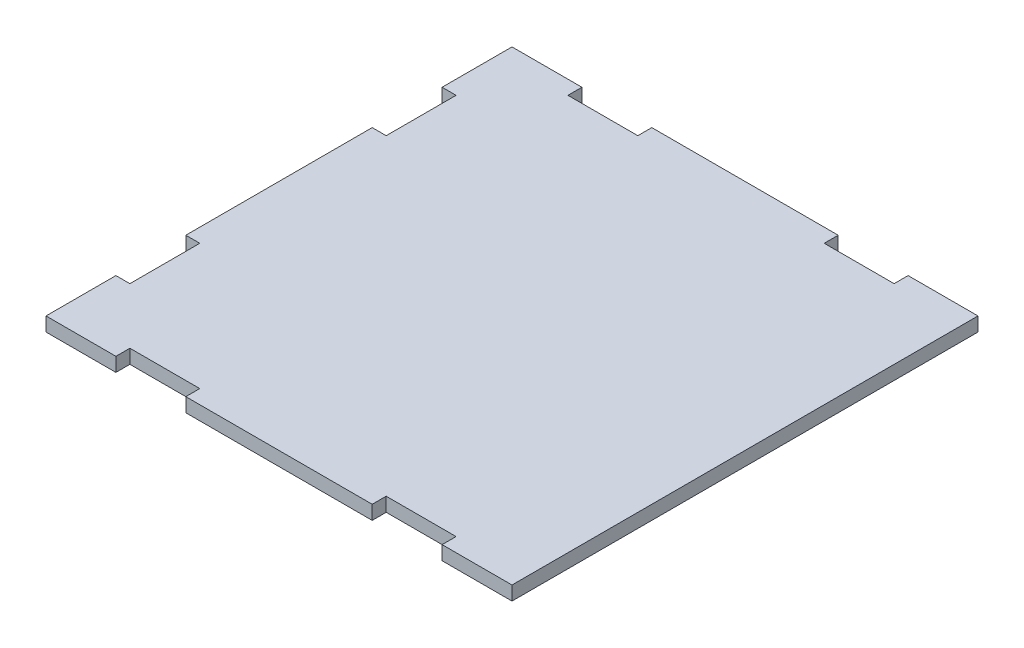
ISO-10303-21;
HEADER;
FILE_DESCRIPTION(('STEP AP214'),'2;1');
FILE_NAME('part.step','',(''),(''),'','','');
FILE_SCHEMA(('AUTOMOTIVE_DESIGN { 1 0 10303 214 1 1 1 1 }'));
ENDSEC;
DATA;
#1=APPLICATION_CONTEXT('core data for automotive mechanical design processes');
#2=APPLICATION_PROTOCOL_DEFINITION('international standard','automotive_design',2000,#1);
#3=PRODUCT_CONTEXT('',#1,'mechanical');
#4=PRODUCT('Part','Part','',(#3));
#5=PRODUCT_RELATED_PRODUCT_CATEGORY('part','',(#4));
#6=PRODUCT_DEFINITION_FORMATION('','',#4);
#7=PRODUCT_DEFINITION_CONTEXT('part definition',#1,'design');
#8=PRODUCT_DEFINITION('design','',#6,#7);
#9=PRODUCT_DEFINITION_SHAPE('','',#8);
#10=(LENGTH_UNIT() NAMED_UNIT(*) SI_UNIT(.MILLI.,.METRE.));
#11=(NAMED_UNIT(*) PLANE_ANGLE_UNIT() SI_UNIT($,.RADIAN.));
#12=(NAMED_UNIT(*) SI_UNIT($,.STERADIAN.) SOLID_ANGLE_UNIT());
#13=UNCERTAINTY_MEASURE_WITH_UNIT(LENGTH_MEASURE(1.E-05),#10,'distance_accuracy_value','');
#14=(GEOMETRIC_REPRESENTATION_CONTEXT(3) GLOBAL_UNCERTAINTY_ASSIGNED_CONTEXT((#13)) GLOBAL_UNIT_ASSIGNED_CONTEXT((#10,
#11,#12)) REPRESENTATION_CONTEXT('',''));
#15=CARTESIAN_POINT('',(0.,0.,0.));
#16=DIRECTION('',(0.,0.,1.));
#17=DIRECTION('',(1.,0.,0.));
#18=AXIS2_PLACEMENT_3D('',#15,#16,#17);
#19=CARTESIAN_POINT('',(-100.,6.,-100.));
#20=DIRECTION('',(0.,0.,1.));
#21=DIRECTION('',(1.,0.,0.));
#22=AXIS2_PLACEMENT_3D('',#19,#20,#21);
#23=PLANE('',#22);
#24=DIRECTION('',(-1.,0.,0.));
#25=VECTOR('',#24,1.);
#26=CARTESIAN_POINT('',(-100.,6.,-100.));
#27=LINE('',#26,#25);
#28=CARTESIAN_POINT('',(40.,6.,-100.));
#29=VERTEX_POINT('',#28);
#30=CARTESIAN_POINT('',(-40.,6.,-100.));
#31=VERTEX_POINT('',#30);
#32=EDGE_CURVE('E479',#29,#31,#27,.T.);
#33=ORIENTED_EDGE('',*,*,#32,.F.);
#34=DIRECTION('',(0.,1.,0.));
#35=VECTOR('',#34,1.);
#36=CARTESIAN_POINT('',(40.,-4.,-100.));
#37=LINE('',#36,#35);
#38=CARTESIAN_POINT('',(40.,0.,-100.));
#39=VERTEX_POINT('',#38);
#40=EDGE_CURVE('E401',#39,#29,#37,.T.);
#41=ORIENTED_EDGE('',*,*,#40,.F.);
#42=DIRECTION('',(-1.,0.,0.));
#43=VECTOR('',#42,1.);
#44=CARTESIAN_POINT('',(-100.,0.,-100.));
#45=LINE('',#44,#43);
#46=CARTESIAN_POINT('',(-40.,0.,-100.));
#47=VERTEX_POINT('',#46);
#48=EDGE_CURVE('E287',#39,#47,#45,.T.);
#49=ORIENTED_EDGE('',*,*,#48,.T.);
#50=DIRECTION('',(0.,1.,0.));
#51=VECTOR('',#50,1.);
#52=CARTESIAN_POINT('',(-40.,-4.,-100.));
#53=LINE('',#52,#51);
#54=EDGE_CURVE('E435',#47,#31,#53,.T.);
#55=ORIENTED_EDGE('',*,*,#54,.T.);
#56=EDGE_LOOP('',(#33,#41,#49,#55));
#57=FACE_BOUND('',#56,.T.);
#58=ADVANCED_FACE('F45',(#57),#23,.F.);
#59=CARTESIAN_POINT('',(-70.,6.,-100.));
#60=VERTEX_POINT('',#59);
#61=CARTESIAN_POINT('',(-100.,6.,-100.));
#62=VERTEX_POINT('',#61);
#63=EDGE_CURVE('E474',#60,#62,#27,.T.);
#64=ORIENTED_EDGE('',*,*,#63,.F.);
#65=DIRECTION('',(0.,1.,0.));
#66=VECTOR('',#65,1.);
#67=CARTESIAN_POINT('',(-70.,-4.,-100.));
#68=LINE('',#67,#66);
#69=CARTESIAN_POINT('',(-70.,0.,-100.));
#70=VERTEX_POINT('',#69);
#71=EDGE_CURVE('E439',#70,#60,#68,.T.);
#72=ORIENTED_EDGE('',*,*,#71,.F.);
#73=CARTESIAN_POINT('',(-100.,0.,-100.));
#74=VERTEX_POINT('',#73);
#75=EDGE_CURVE('E280',#70,#74,#45,.T.);
#76=ORIENTED_EDGE('',*,*,#75,.T.);
#77=DIRECTION('',(0.,-1.,0.));
#78=VECTOR('',#77,1.);
#79=CARTESIAN_POINT('',(-100.,6.,-100.));
#80=LINE('',#79,#78);
#81=EDGE_CURVE('E306',#62,#74,#80,.T.);
#82=ORIENTED_EDGE('',*,*,#81,.F.);
#83=EDGE_LOOP('',(#64,#72,#76,#82));
#84=FACE_BOUND('',#83,.T.);
#85=ADVANCED_FACE('F534',(#84),#23,.F.);
#86=CARTESIAN_POINT('',(-100.,6.,100.));
#87=DIRECTION('',(1.,0.,0.));
#88=DIRECTION('',(0.,0.,-1.));
#89=AXIS2_PLACEMENT_3D('',#86,#87,#88);
#90=PLANE('',#89);
#91=DIRECTION('',(0.,0.,1.));
#92=VECTOR('',#91,1.);
#93=CARTESIAN_POINT('',(-100.,0.,100.));
#94=LINE('',#93,#92);
#95=CARTESIAN_POINT('',(-100.,0.,-70.));
#96=VERTEX_POINT('',#95);
#97=EDGE_CURVE('E288',#74,#96,#94,.T.);
#98=ORIENTED_EDGE('',*,*,#97,.T.);
#99=DIRECTION('',(0.,1.,0.));
#100=VECTOR('',#99,1.);
#101=CARTESIAN_POINT('',(-100.,-4.,-70.));
#102=LINE('',#101,#100);
#103=CARTESIAN_POINT('',(-100.,6.,-70.));
#104=VERTEX_POINT('',#103);
#105=EDGE_CURVE('E392',#96,#104,#102,.T.);
#106=ORIENTED_EDGE('',*,*,#105,.T.);
#107=DIRECTION('',(0.,0.,1.));
#108=VECTOR('',#107,1.);
#109=CARTESIAN_POINT('',(-100.,6.,100.));
#110=LINE('',#109,#108);
#111=EDGE_CURVE('E260',#62,#104,#110,.T.);
#112=ORIENTED_EDGE('',*,*,#111,.F.);
#113=ORIENTED_EDGE('',*,*,#81,.T.);
#114=EDGE_LOOP('',(#98,#106,#112,#113));
#115=FACE_BOUND('',#114,.T.);
#116=ADVANCED_FACE('F538',(#115),#90,.F.);
#117=CARTESIAN_POINT('',(-100.,6.,-40.));
#118=VERTEX_POINT('',#117);
#119=CARTESIAN_POINT('',(-100.,6.,40.));
#120=VERTEX_POINT('',#119);
#121=EDGE_CURVE('E249',#118,#120,#110,.T.);
#122=ORIENTED_EDGE('',*,*,#121,.F.);
#123=DIRECTION('',(0.,1.,0.));
#124=VECTOR('',#123,1.);
#125=CARTESIAN_POINT('',(-100.,-4.,-40.));
#126=LINE('',#125,#124);
#127=CARTESIAN_POINT('',(-100.,0.,-40.));
#128=VERTEX_POINT('',#127);
#129=EDGE_CURVE('E377',#128,#118,#126,.T.);
#130=ORIENTED_EDGE('',*,*,#129,.F.);
#131=CARTESIAN_POINT('',(-100.,0.,40.));
#132=VERTEX_POINT('',#131);
#133=EDGE_CURVE('E251',#128,#132,#94,.T.);
#134=ORIENTED_EDGE('',*,*,#133,.T.);
#135=DIRECTION('',(0.,1.,0.));
#136=VECTOR('',#135,1.);
#137=CARTESIAN_POINT('',(-100.,-4.,40.));
#138=LINE('',#137,#136);
#139=EDGE_CURVE('E232',#132,#120,#138,.T.);
#140=ORIENTED_EDGE('',*,*,#139,.T.);
#141=EDGE_LOOP('',(#122,#130,#134,#140));
#142=FACE_BOUND('',#141,.T.);
#143=ADVANCED_FACE('F247',(#142),#90,.F.);
#144=CARTESIAN_POINT('',(-100.,6.,100.));
#145=DIRECTION('',(0.,0.,-1.));
#146=DIRECTION('',(-1.,0.,0.));
#147=AXIS2_PLACEMENT_3D('',#144,#145,#146);
#148=PLANE('',#147);
#149=DIRECTION('',(1.,0.,0.));
#150=VECTOR('',#149,1.);
#151=CARTESIAN_POINT('',(-100.,0.,100.));
#152=LINE('',#151,#150);
#153=CARTESIAN_POINT('',(-40.,0.,100.));
#154=VERTEX_POINT('',#153);
#155=CARTESIAN_POINT('',(40.,0.,100.));
#156=VERTEX_POINT('',#155);
#157=EDGE_CURVE('E298',#154,#156,#152,.T.);
#158=ORIENTED_EDGE('',*,*,#157,.T.);
#159=DIRECTION('',(0.,1.,0.));
#160=VECTOR('',#159,1.);
#161=CARTESIAN_POINT('',(40.,-4.,100.));
#162=LINE('',#161,#160);
#163=CARTESIAN_POINT('',(40.,6.,100.));
#164=VERTEX_POINT('',#163);
#165=EDGE_CURVE('E402',#156,#164,#162,.T.);
#166=ORIENTED_EDGE('',*,*,#165,.T.);
#167=DIRECTION('',(1.,0.,0.));
#168=VECTOR('',#167,1.);
#169=CARTESIAN_POINT('',(-100.,6.,100.));
#170=LINE('',#169,#168);
#171=CARTESIAN_POINT('',(-40.,6.,100.));
#172=VERTEX_POINT('',#171);
#173=EDGE_CURVE('E275',#172,#164,#170,.T.);
#174=ORIENTED_EDGE('',*,*,#173,.F.);
#175=DIRECTION('',(0.,1.,0.));
#176=VECTOR('',#175,1.);
#177=CARTESIAN_POINT('',(-40.,-4.,100.));
#178=LINE('',#177,#176);
#179=EDGE_CURVE('E467',#154,#172,#178,.T.);
#180=ORIENTED_EDGE('',*,*,#179,.F.);
#181=EDGE_LOOP('',(#158,#166,#174,#180));
#182=FACE_BOUND('',#181,.T.);
#183=ADVANCED_FACE('F552',(#182),#148,.F.);
#184=CARTESIAN_POINT('',(-100.,0.,100.));
#185=VERTEX_POINT('',#184);
#186=CARTESIAN_POINT('',(-70.,0.,100.));
#187=VERTEX_POINT('',#186);
#188=EDGE_CURVE('E293',#185,#187,#152,.T.);
#189=ORIENTED_EDGE('',*,*,#188,.T.);
#190=DIRECTION('',(0.,1.,0.));
#191=VECTOR('',#190,1.);
#192=CARTESIAN_POINT('',(-70.,-4.,100.));
#193=LINE('',#192,#191);
#194=CARTESIAN_POINT('',(-70.,6.,100.));
#195=VERTEX_POINT('',#194);
#196=EDGE_CURVE('E461',#187,#195,#193,.T.);
#197=ORIENTED_EDGE('',*,*,#196,.T.);
#198=CARTESIAN_POINT('',(-100.,6.,100.));
#199=VERTEX_POINT('',#198);
#200=EDGE_CURVE('E270',#199,#195,#170,.T.);
#201=ORIENTED_EDGE('',*,*,#200,.F.);
#202=DIRECTION('',(0.,-1.,0.));
#203=VECTOR('',#202,1.);
#204=CARTESIAN_POINT('',(-100.,6.,100.));
#205=LINE('',#204,#203);
#206=EDGE_CURVE('E302',#199,#185,#205,.T.);
#207=ORIENTED_EDGE('',*,*,#206,.T.);
#208=EDGE_LOOP('',(#189,#197,#201,#207));
#209=FACE_BOUND('',#208,.T.);
#210=ADVANCED_FACE('F605',(#209),#148,.F.);
#211=CARTESIAN_POINT('',(100.,6.,100.));
#212=DIRECTION('',(-1.,0.,0.));
#213=DIRECTION('',(0.,0.,1.));
#214=AXIS2_PLACEMENT_3D('',#211,#212,#213);
#215=PLANE('',#214);
#216=DIRECTION('',(0.,0.,-1.));
#217=VECTOR('',#216,1.);
#218=CARTESIAN_POINT('',(100.,0.,100.));
#219=LINE('',#218,#217);
#220=CARTESIAN_POINT('',(100.,0.,100.));
#221=VERTEX_POINT('',#220);
#222=CARTESIAN_POINT('',(100.,0.,-100.));
#223=VERTEX_POINT('',#222);
#224=EDGE_CURVE('E276',#221,#223,#219,.T.);
#225=ORIENTED_EDGE('',*,*,#224,.T.);
#226=DIRECTION('',(0.,-1.,0.));
#227=VECTOR('',#226,1.);
#228=CARTESIAN_POINT('',(100.,6.,-100.));
#229=LINE('',#228,#227);
#230=CARTESIAN_POINT('',(100.,6.,-100.));
#231=VERTEX_POINT('',#230);
#232=EDGE_CURVE('E310',#231,#223,#229,.T.);
#233=ORIENTED_EDGE('',*,*,#232,.F.);
#234=DIRECTION('',(0.,0.,-1.));
#235=VECTOR('',#234,1.);
#236=CARTESIAN_POINT('',(100.,6.,100.));
#237=LINE('',#236,#235);
#238=CARTESIAN_POINT('',(100.,6.,100.));
#239=VERTEX_POINT('',#238);
#240=EDGE_CURVE('E297',#239,#231,#237,.T.);
#241=ORIENTED_EDGE('',*,*,#240,.F.);
#242=DIRECTION('',(0.,-1.,0.));
#243=VECTOR('',#242,1.);
#244=CARTESIAN_POINT('',(100.,6.,100.));
#245=LINE('',#244,#243);
#246=EDGE_CURVE('E274',#239,#221,#245,.T.);
#247=ORIENTED_EDGE('',*,*,#246,.T.);
#248=EDGE_LOOP('',(#225,#233,#241,#247));
#249=FACE_BOUND('',#248,.T.);
#250=ADVANCED_FACE('F47',(#249),#215,.F.);
#251=CARTESIAN_POINT('',(70.,0.,-100.));
#252=VERTEX_POINT('',#251);
#253=EDGE_CURVE('E282',#223,#252,#45,.T.);
#254=ORIENTED_EDGE('',*,*,#253,.T.);
#255=DIRECTION('',(0.,1.,0.));
#256=VECTOR('',#255,1.);
#257=CARTESIAN_POINT('',(70.,-4.,-100.));
#258=LINE('',#257,#256);
#259=CARTESIAN_POINT('',(70.,6.,-100.));
#260=VERTEX_POINT('',#259);
#261=EDGE_CURVE('E492',#252,#260,#258,.T.);
#262=ORIENTED_EDGE('',*,*,#261,.T.);
#263=EDGE_CURVE('E266',#231,#260,#27,.T.);
#264=ORIENTED_EDGE('',*,*,#263,.F.);
#265=ORIENTED_EDGE('',*,*,#232,.T.);
#266=EDGE_LOOP('',(#254,#262,#264,#265));
#267=FACE_BOUND('',#266,.T.);
#268=ADVANCED_FACE('F491',(#267),#23,.F.);
#269=CARTESIAN_POINT('',(-100.,6.,70.));
#270=VERTEX_POINT('',#269);
#271=EDGE_CURVE('E261',#270,#199,#110,.T.);
#272=ORIENTED_EDGE('',*,*,#271,.F.);
#273=DIRECTION('',(0.,1.,0.));
#274=VECTOR('',#273,1.);
#275=CARTESIAN_POINT('',(-100.,-4.,70.));
#276=LINE('',#275,#274);
#277=CARTESIAN_POINT('',(-100.,0.,70.));
#278=VERTEX_POINT('',#277);
#279=EDGE_CURVE('E242',#278,#270,#276,.T.);
#280=ORIENTED_EDGE('',*,*,#279,.F.);
#281=EDGE_CURVE('E286',#278,#185,#94,.T.);
#282=ORIENTED_EDGE('',*,*,#281,.T.);
#283=ORIENTED_EDGE('',*,*,#206,.F.);
#284=EDGE_LOOP('',(#272,#280,#282,#283));
#285=FACE_BOUND('',#284,.T.);
#286=ADVANCED_FACE('F599',(#285),#90,.F.);
#287=CARTESIAN_POINT('',(70.,6.,100.));
#288=VERTEX_POINT('',#287);
#289=EDGE_CURVE('E265',#288,#239,#170,.T.);
#290=ORIENTED_EDGE('',*,*,#289,.F.);
#291=DIRECTION('',(0.,1.,0.));
#292=VECTOR('',#291,1.);
#293=CARTESIAN_POINT('',(70.,-4.,100.));
#294=LINE('',#293,#292);
#295=CARTESIAN_POINT('',(70.,0.,100.));
#296=VERTEX_POINT('',#295);
#297=EDGE_CURVE('E407',#296,#288,#294,.T.);
#298=ORIENTED_EDGE('',*,*,#297,.F.);
#299=EDGE_CURVE('E292',#296,#221,#152,.T.);
#300=ORIENTED_EDGE('',*,*,#299,.T.);
#301=ORIENTED_EDGE('',*,*,#246,.F.);
#302=EDGE_LOOP('',(#290,#298,#300,#301));
#303=FACE_BOUND('',#302,.T.);
#304=ADVANCED_FACE('F576',(#303),#148,.F.);
#305=CARTESIAN_POINT('',(0.,6.,0.));
#306=DIRECTION('',(0.,-1.,0.));
#307=DIRECTION('',(0.,0.,-1.));
#308=AXIS2_PLACEMENT_3D('',#305,#306,#307);
#309=PLANE('',#308);
#310=ORIENTED_EDGE('',*,*,#111,.T.);
#311=DIRECTION('',(-1.,0.,0.));
#312=VECTOR('',#311,1.);
#313=CARTESIAN_POINT('',(-100.,6.,-70.));
#314=LINE('',#313,#312);
#315=CARTESIAN_POINT('',(-94.,6.,-70.));
#316=VERTEX_POINT('',#315);
#317=EDGE_CURVE('E379',#316,#104,#314,.T.);
#318=ORIENTED_EDGE('',*,*,#317,.F.);
#319=DIRECTION('',(0.,0.,-1.));
#320=VECTOR('',#319,1.);
#321=CARTESIAN_POINT('',(-94.,6.,-70.));
#322=LINE('',#321,#320);
#323=CARTESIAN_POINT('',(-94.,6.,-40.));
#324=VERTEX_POINT('',#323);
#325=EDGE_CURVE('E383',#324,#316,#322,.T.);
#326=ORIENTED_EDGE('',*,*,#325,.F.);
#327=DIRECTION('',(1.,0.,0.));
#328=VECTOR('',#327,1.);
#329=CARTESIAN_POINT('',(-100.,6.,-40.));
#330=LINE('',#329,#328);
#331=EDGE_CURVE('E258',#118,#324,#330,.T.);
#332=ORIENTED_EDGE('',*,*,#331,.F.);
#333=ORIENTED_EDGE('',*,*,#121,.T.);
#334=DIRECTION('',(-1.,0.,0.));
#335=VECTOR('',#334,1.);
#336=CARTESIAN_POINT('',(-100.,6.,40.));
#337=LINE('',#336,#335);
#338=CARTESIAN_POINT('',(-94.,6.,40.));
#339=VERTEX_POINT('',#338);
#340=EDGE_CURVE('E229',#339,#120,#337,.T.);
#341=ORIENTED_EDGE('',*,*,#340,.F.);
#342=DIRECTION('',(0.,0.,-1.));
#343=VECTOR('',#342,1.);
#344=CARTESIAN_POINT('',(-94.,6.,40.));
#345=LINE('',#344,#343);
#346=CARTESIAN_POINT('',(-94.,6.,70.));
#347=VERTEX_POINT('',#346);
#348=EDGE_CURVE('E241',#347,#339,#345,.T.);
#349=ORIENTED_EDGE('',*,*,#348,.F.);
#350=DIRECTION('',(1.,0.,0.));
#351=VECTOR('',#350,1.);
#352=CARTESIAN_POINT('',(-100.,6.,70.));
#353=LINE('',#352,#351);
#354=EDGE_CURVE('E395',#270,#347,#353,.T.);
#355=ORIENTED_EDGE('',*,*,#354,.F.);
#356=ORIENTED_EDGE('',*,*,#271,.T.);
#357=ORIENTED_EDGE('',*,*,#200,.T.);
#358=DIRECTION('',(0.,0.,1.));
#359=VECTOR('',#358,1.);
#360=CARTESIAN_POINT('',(-70.,6.,100.));
#361=LINE('',#360,#359);
#362=CARTESIAN_POINT('',(-70.,6.,94.));
#363=VERTEX_POINT('',#362);
#364=EDGE_CURVE('E427',#363,#195,#361,.T.);
#365=ORIENTED_EDGE('',*,*,#364,.F.);
#366=DIRECTION('',(-1.,0.,0.));
#367=VECTOR('',#366,1.);
#368=CARTESIAN_POINT('',(-70.,6.,94.));
#369=LINE('',#368,#367);
#370=CARTESIAN_POINT('',(-40.,6.,94.));
#371=VERTEX_POINT('',#370);
#372=EDGE_CURVE('E457',#371,#363,#369,.T.);
#373=ORIENTED_EDGE('',*,*,#372,.F.);
#374=DIRECTION('',(0.,0.,-1.));
#375=VECTOR('',#374,1.);
#376=CARTESIAN_POINT('',(-40.,6.,100.));
#377=LINE('',#376,#375);
#378=EDGE_CURVE('E453',#172,#371,#377,.T.);
#379=ORIENTED_EDGE('',*,*,#378,.F.);
#380=ORIENTED_EDGE('',*,*,#173,.T.);
#381=DIRECTION('',(0.,0.,1.));
#382=VECTOR('',#381,1.);
#383=CARTESIAN_POINT('',(40.,6.,100.));
#384=LINE('',#383,#382);
#385=CARTESIAN_POINT('',(40.,6.,94.));
#386=VERTEX_POINT('',#385);
#387=EDGE_CURVE('E424',#386,#164,#384,.T.);
#388=ORIENTED_EDGE('',*,*,#387,.F.);
#389=DIRECTION('',(-1.,0.,0.));
#390=VECTOR('',#389,1.);
#391=CARTESIAN_POINT('',(40.,6.,94.));
#392=LINE('',#391,#390);
#393=CARTESIAN_POINT('',(70.,6.,94.));
#394=VERTEX_POINT('',#393);
#395=EDGE_CURVE('E406',#394,#386,#392,.T.);
#396=ORIENTED_EDGE('',*,*,#395,.F.);
#397=DIRECTION('',(0.,0.,-1.));
#398=VECTOR('',#397,1.);
#399=CARTESIAN_POINT('',(70.,6.,100.));
#400=LINE('',#399,#398);
#401=EDGE_CURVE('E420',#288,#394,#400,.T.);
#402=ORIENTED_EDGE('',*,*,#401,.F.);
#403=ORIENTED_EDGE('',*,*,#289,.T.);
#404=ORIENTED_EDGE('',*,*,#240,.T.);
#405=ORIENTED_EDGE('',*,*,#263,.T.);
#406=DIRECTION('',(0.,0.,-1.));
#407=VECTOR('',#406,1.);
#408=CARTESIAN_POINT('',(70.,6.,-100.));
#409=LINE('',#408,#407);
#410=CARTESIAN_POINT('',(70.,6.,-94.));
#411=VERTEX_POINT('',#410);
#412=EDGE_CURVE('E488',#411,#260,#409,.T.);
#413=ORIENTED_EDGE('',*,*,#412,.F.);
#414=DIRECTION('',(1.,0.,0.));
#415=VECTOR('',#414,1.);
#416=CARTESIAN_POINT('',(40.,6.,-94.));
#417=LINE('',#416,#415);
#418=CARTESIAN_POINT('',(40.,6.,-94.));
#419=VERTEX_POINT('',#418);
#420=EDGE_CURVE('E505',#419,#411,#417,.T.);
#421=ORIENTED_EDGE('',*,*,#420,.F.);
#422=DIRECTION('',(0.,0.,1.));
#423=VECTOR('',#422,1.);
#424=CARTESIAN_POINT('',(40.,6.,-100.));
#425=LINE('',#424,#423);
#426=EDGE_CURVE('E387',#29,#419,#425,.T.);
#427=ORIENTED_EDGE('',*,*,#426,.F.);
#428=ORIENTED_EDGE('',*,*,#32,.T.);
#429=DIRECTION('',(0.,0.,-1.));
#430=VECTOR('',#429,1.);
#431=CARTESIAN_POINT('',(-40.,6.,-100.));
#432=LINE('',#431,#430);
#433=CARTESIAN_POINT('',(-40.,6.,-94.));
#434=VERTEX_POINT('',#433);
#435=EDGE_CURVE('E431',#434,#31,#432,.T.);
#436=ORIENTED_EDGE('',*,*,#435,.F.);
#437=DIRECTION('',(1.,0.,0.));
#438=VECTOR('',#437,1.);
#439=CARTESIAN_POINT('',(-70.,6.,-94.));
#440=LINE('',#439,#438);
#441=CARTESIAN_POINT('',(-70.,6.,-94.));
#442=VERTEX_POINT('',#441);
#443=EDGE_CURVE('E444',#442,#434,#440,.T.);
#444=ORIENTED_EDGE('',*,*,#443,.F.);
#445=DIRECTION('',(0.,0.,1.));
#446=VECTOR('',#445,1.);
#447=CARTESIAN_POINT('',(-70.,6.,-100.));
#448=LINE('',#447,#446);
#449=EDGE_CURVE('E416',#60,#442,#448,.T.);
#450=ORIENTED_EDGE('',*,*,#449,.F.);
#451=ORIENTED_EDGE('',*,*,#63,.T.);
#452=EDGE_LOOP('',(#310,#318,#326,#332,#333,#341,#349,#355,#356,#357,#365,#373,#379,#380,#388,
#396,#402,#403,#404,#405,#413,#421,#427,#428,#436,#444,#450,#451));
#453=FACE_BOUND('',#452,.T.);
#454=ADVANCED_FACE('F256',(#453),#309,.F.);
#455=CARTESIAN_POINT('',(0.,0.,0.));
#456=DIRECTION('',(0.,-1.,0.));
#457=DIRECTION('',(0.,0.,-1.));
#458=AXIS2_PLACEMENT_3D('',#455,#456,#457);
#459=PLANE('',#458);
#460=DIRECTION('',(1.,0.,0.));
#461=VECTOR('',#460,1.);
#462=CARTESIAN_POINT('',(0.,0.,-70.));
#463=LINE('',#462,#461);
#464=CARTESIAN_POINT('',(-94.,0.,-70.));
#465=VERTEX_POINT('',#464);
#466=EDGE_CURVE('E11',#96,#465,#463,.T.);
#467=ORIENTED_EDGE('',*,*,#466,.F.);
#468=ORIENTED_EDGE('',*,*,#97,.F.);
#469=ORIENTED_EDGE('',*,*,#75,.F.);
#470=DIRECTION('',(0.,0.,-1.));
#471=VECTOR('',#470,1.);
#472=CARTESIAN_POINT('',(-70.,0.,0.));
#473=LINE('',#472,#471);
#474=CARTESIAN_POINT('',(-70.,0.,-94.));
#475=VERTEX_POINT('',#474);
#476=EDGE_CURVE('E351',#475,#70,#473,.T.);
#477=ORIENTED_EDGE('',*,*,#476,.F.);
#478=DIRECTION('',(-1.,0.,0.));
#479=VECTOR('',#478,1.);
#480=CARTESIAN_POINT('',(0.,0.,-94.));
#481=LINE('',#480,#479);
#482=CARTESIAN_POINT('',(-40.,0.,-94.));
#483=VERTEX_POINT('',#482);
#484=EDGE_CURVE('E344',#483,#475,#481,.T.);
#485=ORIENTED_EDGE('',*,*,#484,.F.);
#486=DIRECTION('',(0.,0.,1.));
#487=VECTOR('',#486,1.);
#488=CARTESIAN_POINT('',(-40.,0.,0.));
#489=LINE('',#488,#487);
#490=EDGE_CURVE('E347',#47,#483,#489,.T.);
#491=ORIENTED_EDGE('',*,*,#490,.F.);
#492=ORIENTED_EDGE('',*,*,#48,.F.);
#493=DIRECTION('',(0.,0.,-1.));
#494=VECTOR('',#493,1.);
#495=CARTESIAN_POINT('',(40.,0.,0.));
#496=LINE('',#495,#494);
#497=CARTESIAN_POINT('',(40.,0.,-94.));
#498=VERTEX_POINT('',#497);
#499=EDGE_CURVE('E360',#498,#39,#496,.T.);
#500=ORIENTED_EDGE('',*,*,#499,.F.);
#501=DIRECTION('',(-1.,0.,0.));
#502=VECTOR('',#501,1.);
#503=CARTESIAN_POINT('',(0.,0.,-94.));
#504=LINE('',#503,#502);
#505=CARTESIAN_POINT('',(70.,0.,-94.));
#506=VERTEX_POINT('',#505);
#507=EDGE_CURVE('E354',#506,#498,#504,.T.);
#508=ORIENTED_EDGE('',*,*,#507,.F.);
#509=DIRECTION('',(0.,0.,1.));
#510=VECTOR('',#509,1.);
#511=CARTESIAN_POINT('',(70.,0.,0.));
#512=LINE('',#511,#510);
#513=EDGE_CURVE('E357',#252,#506,#512,.T.);
#514=ORIENTED_EDGE('',*,*,#513,.F.);
#515=ORIENTED_EDGE('',*,*,#253,.F.);
#516=ORIENTED_EDGE('',*,*,#224,.F.);
#517=ORIENTED_EDGE('',*,*,#299,.F.);
#518=DIRECTION('',(0.,0.,1.));
#519=VECTOR('',#518,1.);
#520=CARTESIAN_POINT('',(70.,0.,0.));
#521=LINE('',#520,#519);
#522=CARTESIAN_POINT('',(70.,0.,94.));
#523=VERTEX_POINT('',#522);
#524=EDGE_CURVE('E334',#523,#296,#521,.T.);
#525=ORIENTED_EDGE('',*,*,#524,.F.);
#526=DIRECTION('',(1.,0.,0.));
#527=VECTOR('',#526,1.);
#528=CARTESIAN_POINT('',(0.,0.,94.));
#529=LINE('',#528,#527);
#530=CARTESIAN_POINT('',(40.,0.,94.));
#531=VERTEX_POINT('',#530);
#532=EDGE_CURVE('E337',#531,#523,#529,.T.);
#533=ORIENTED_EDGE('',*,*,#532,.F.);
#534=DIRECTION('',(0.,0.,-1.));
#535=VECTOR('',#534,1.);
#536=CARTESIAN_POINT('',(40.,0.,0.));
#537=LINE('',#536,#535);
#538=EDGE_CURVE('E341',#156,#531,#537,.T.);
#539=ORIENTED_EDGE('',*,*,#538,.F.);
#540=ORIENTED_EDGE('',*,*,#157,.F.);
#541=DIRECTION('',(0.,0.,1.));
#542=VECTOR('',#541,1.);
#543=CARTESIAN_POINT('',(-40.,0.,0.));
#544=LINE('',#543,#542);
#545=CARTESIAN_POINT('',(-40.,0.,94.));
#546=VERTEX_POINT('',#545);
#547=EDGE_CURVE('E314',#546,#154,#544,.T.);
#548=ORIENTED_EDGE('',*,*,#547,.F.);
#549=DIRECTION('',(1.,0.,0.));
#550=VECTOR('',#549,1.);
#551=CARTESIAN_POINT('',(0.,0.,94.));
#552=LINE('',#551,#550);
#553=CARTESIAN_POINT('',(-70.,0.,94.));
#554=VERTEX_POINT('',#553);
#555=EDGE_CURVE('E317',#554,#546,#552,.T.);
#556=ORIENTED_EDGE('',*,*,#555,.F.);
#557=DIRECTION('',(0.,0.,-1.));
#558=VECTOR('',#557,1.);
#559=CARTESIAN_POINT('',(-70.,0.,0.));
#560=LINE('',#559,#558);
#561=EDGE_CURVE('E321',#187,#554,#560,.T.);
#562=ORIENTED_EDGE('',*,*,#561,.F.);
#563=ORIENTED_EDGE('',*,*,#188,.F.);
#564=ORIENTED_EDGE('',*,*,#281,.F.);
#565=DIRECTION('',(-1.,0.,0.));
#566=VECTOR('',#565,1.);
#567=CARTESIAN_POINT('',(0.,0.,70.));
#568=LINE('',#567,#566);
#569=CARTESIAN_POINT('',(-94.,0.,70.));
#570=VERTEX_POINT('',#569);
#571=EDGE_CURVE('E324',#570,#278,#568,.T.);
#572=ORIENTED_EDGE('',*,*,#571,.F.);
#573=DIRECTION('',(0.,0.,1.));
#574=VECTOR('',#573,1.);
#575=CARTESIAN_POINT('',(-94.,0.,0.));
#576=LINE('',#575,#574);
#577=CARTESIAN_POINT('',(-94.,0.,40.));
#578=VERTEX_POINT('',#577);
#579=EDGE_CURVE('E327',#578,#570,#576,.T.);
#580=ORIENTED_EDGE('',*,*,#579,.F.);
#581=DIRECTION('',(1.,0.,0.));
#582=VECTOR('',#581,1.);
#583=CARTESIAN_POINT('',(0.,0.,40.));
#584=LINE('',#583,#582);
#585=EDGE_CURVE('E331',#132,#578,#584,.T.);
#586=ORIENTED_EDGE('',*,*,#585,.F.);
#587=ORIENTED_EDGE('',*,*,#133,.F.);
#588=DIRECTION('',(-1.,0.,0.));
#589=VECTOR('',#588,1.);
#590=CARTESIAN_POINT('',(0.,0.,-40.));
#591=LINE('',#590,#589);
#592=CARTESIAN_POINT('',(-94.,0.,-40.));
#593=VERTEX_POINT('',#592);
#594=EDGE_CURVE('E363',#593,#128,#591,.T.);
#595=ORIENTED_EDGE('',*,*,#594,.F.);
#596=DIRECTION('',(0.,0.,1.));
#597=VECTOR('',#596,1.);
#598=CARTESIAN_POINT('',(-94.,0.,0.));
#599=LINE('',#598,#597);
#600=EDGE_CURVE('E54',#465,#593,#599,.T.);
#601=ORIENTED_EDGE('',*,*,#600,.F.);
#602=EDGE_LOOP('',(#467,#468,#469,#477,#485,#491,#492,#500,#508,#514,#515,#516,#517,#525,#533,
#539,#540,#548,#556,#562,#563,#564,#572,#580,#586,#587,#595,#601));
#603=FACE_BOUND('',#602,.T.);
#604=ADVANCED_FACE('F375',(#603),#459,.T.);
#605=CARTESIAN_POINT('',(-70.,-4.,100.));
#606=DIRECTION('',(-1.,0.,0.));
#607=DIRECTION('',(0.,0.,1.));
#608=AXIS2_PLACEMENT_3D('',#605,#606,#607);
#609=PLANE('',#608);
#610=ORIENTED_EDGE('',*,*,#561,.T.);
#611=DIRECTION('',(0.,1.,0.));
#612=VECTOR('',#611,1.);
#613=CARTESIAN_POINT('',(-70.,-4.,94.));
#614=LINE('',#613,#612);
#615=EDGE_CURVE('E281',#554,#363,#614,.T.);
#616=ORIENTED_EDGE('',*,*,#615,.T.);
#617=ORIENTED_EDGE('',*,*,#364,.T.);
#618=ORIENTED_EDGE('',*,*,#196,.F.);
#619=EDGE_LOOP('',(#610,#616,#617,#618));
#620=FACE_BOUND('',#619,.T.);
#621=ADVANCED_FACE('F622',(#620),#609,.F.);
#622=CARTESIAN_POINT('',(-70.,-4.,94.));
#623=DIRECTION('',(0.,0.,-1.));
#624=DIRECTION('',(-1.,0.,0.));
#625=AXIS2_PLACEMENT_3D('',#622,#623,#624);
#626=PLANE('',#625);
#627=ORIENTED_EDGE('',*,*,#555,.T.);
#628=DIRECTION('',(0.,1.,0.));
#629=VECTOR('',#628,1.);
#630=CARTESIAN_POINT('',(-40.,-4.,94.));
#631=LINE('',#630,#629);
#632=EDGE_CURVE('E464',#546,#371,#631,.T.);
#633=ORIENTED_EDGE('',*,*,#632,.T.);
#634=ORIENTED_EDGE('',*,*,#372,.T.);
#635=ORIENTED_EDGE('',*,*,#615,.F.);
#636=EDGE_LOOP('',(#627,#633,#634,#635));
#637=FACE_BOUND('',#636,.T.);
#638=ADVANCED_FACE('F626',(#637),#626,.F.);
#639=CARTESIAN_POINT('',(-40.,-4.,100.));
#640=DIRECTION('',(1.,0.,0.));
#641=DIRECTION('',(0.,0.,-1.));
#642=AXIS2_PLACEMENT_3D('',#639,#640,#641);
#643=PLANE('',#642);
#644=ORIENTED_EDGE('',*,*,#547,.T.);
#645=ORIENTED_EDGE('',*,*,#179,.T.);
#646=ORIENTED_EDGE('',*,*,#378,.T.);
#647=ORIENTED_EDGE('',*,*,#632,.F.);
#648=EDGE_LOOP('',(#644,#645,#646,#647));
#649=FACE_BOUND('',#648,.T.);
#650=ADVANCED_FACE('F628',(#649),#643,.F.);
#651=CARTESIAN_POINT('',(-100.,-4.,40.));
#652=DIRECTION('',(0.,0.,-1.));
#653=DIRECTION('',(-1.,0.,0.));
#654=AXIS2_PLACEMENT_3D('',#651,#652,#653);
#655=PLANE('',#654);
#656=ORIENTED_EDGE('',*,*,#585,.T.);
#657=DIRECTION('',(0.,1.,0.));
#658=VECTOR('',#657,1.);
#659=CARTESIAN_POINT('',(-94.,-4.,40.));
#660=LINE('',#659,#658);
#661=EDGE_CURVE('E235',#578,#339,#660,.T.);
#662=ORIENTED_EDGE('',*,*,#661,.T.);
#663=ORIENTED_EDGE('',*,*,#340,.T.);
#664=ORIENTED_EDGE('',*,*,#139,.F.);
#665=EDGE_LOOP('',(#656,#662,#663,#664));
#666=FACE_BOUND('',#665,.T.);
#667=ADVANCED_FACE('F231',(#666),#655,.F.);
#668=CARTESIAN_POINT('',(-94.,-4.,40.));
#669=DIRECTION('',(1.,0.,0.));
#670=DIRECTION('',(0.,0.,-1.));
#671=AXIS2_PLACEMENT_3D('',#668,#669,#670);
#672=PLANE('',#671);
#673=ORIENTED_EDGE('',*,*,#579,.T.);
#674=DIRECTION('',(0.,1.,0.));
#675=VECTOR('',#674,1.);
#676=CARTESIAN_POINT('',(-94.,-4.,70.));
#677=LINE('',#676,#675);
#678=EDGE_CURVE('E830',#570,#347,#677,.T.);
#679=ORIENTED_EDGE('',*,*,#678,.T.);
#680=ORIENTED_EDGE('',*,*,#348,.T.);
#681=ORIENTED_EDGE('',*,*,#661,.F.);
#682=EDGE_LOOP('',(#673,#679,#680,#681));
#683=FACE_BOUND('',#682,.T.);
#684=ADVANCED_FACE('F727',(#683),#672,.F.);
#685=CARTESIAN_POINT('',(-100.,-4.,70.));
#686=DIRECTION('',(0.,0.,1.));
#687=DIRECTION('',(1.,0.,0.));
#688=AXIS2_PLACEMENT_3D('',#685,#686,#687);
#689=PLANE('',#688);
#690=ORIENTED_EDGE('',*,*,#571,.T.);
#691=ORIENTED_EDGE('',*,*,#279,.T.);
#692=ORIENTED_EDGE('',*,*,#354,.T.);
#693=ORIENTED_EDGE('',*,*,#678,.F.);
#694=EDGE_LOOP('',(#690,#691,#692,#693));
#695=FACE_BOUND('',#694,.T.);
#696=ADVANCED_FACE('F649',(#695),#689,.F.);
#697=CARTESIAN_POINT('',(40.,-4.,100.));
#698=DIRECTION('',(-1.,0.,0.));
#699=DIRECTION('',(0.,0.,1.));
#700=AXIS2_PLACEMENT_3D('',#697,#698,#699);
#701=PLANE('',#700);
#702=ORIENTED_EDGE('',*,*,#538,.T.);
#703=DIRECTION('',(0.,1.,0.));
#704=VECTOR('',#703,1.);
#705=CARTESIAN_POINT('',(40.,-4.,94.));
#706=LINE('',#705,#704);
#707=EDGE_CURVE('E413',#531,#386,#706,.T.);
#708=ORIENTED_EDGE('',*,*,#707,.T.);
#709=ORIENTED_EDGE('',*,*,#387,.T.);
#710=ORIENTED_EDGE('',*,*,#165,.F.);
#711=EDGE_LOOP('',(#702,#708,#709,#710));
#712=FACE_BOUND('',#711,.T.);
#713=ADVANCED_FACE('F562',(#712),#701,.F.);
#714=CARTESIAN_POINT('',(40.,-4.,94.));
#715=DIRECTION('',(0.,0.,-1.));
#716=DIRECTION('',(-1.,0.,0.));
#717=AXIS2_PLACEMENT_3D('',#714,#715,#716);
#718=PLANE('',#717);
#719=ORIENTED_EDGE('',*,*,#532,.T.);
#720=DIRECTION('',(0.,1.,0.));
#721=VECTOR('',#720,1.);
#722=CARTESIAN_POINT('',(70.,-4.,94.));
#723=LINE('',#722,#721);
#724=EDGE_CURVE('E410',#523,#394,#723,.T.);
#725=ORIENTED_EDGE('',*,*,#724,.T.);
#726=ORIENTED_EDGE('',*,*,#395,.T.);
#727=ORIENTED_EDGE('',*,*,#707,.F.);
#728=EDGE_LOOP('',(#719,#725,#726,#727));
#729=FACE_BOUND('',#728,.T.);
#730=ADVANCED_FACE('F564',(#729),#718,.F.);
#731=CARTESIAN_POINT('',(70.,-4.,100.));
#732=DIRECTION('',(1.,0.,0.));
#733=DIRECTION('',(0.,0.,-1.));
#734=AXIS2_PLACEMENT_3D('',#731,#732,#733);
#735=PLANE('',#734);
#736=ORIENTED_EDGE('',*,*,#524,.T.);
#737=ORIENTED_EDGE('',*,*,#297,.T.);
#738=ORIENTED_EDGE('',*,*,#401,.T.);
#739=ORIENTED_EDGE('',*,*,#724,.F.);
#740=EDGE_LOOP('',(#736,#737,#738,#739));
#741=FACE_BOUND('',#740,.T.);
#742=ADVANCED_FACE('F641',(#741),#735,.F.);
#743=CARTESIAN_POINT('',(-70.,-4.,-100.));
#744=DIRECTION('',(-1.,0.,0.));
#745=DIRECTION('',(0.,0.,1.));
#746=AXIS2_PLACEMENT_3D('',#743,#744,#745);
#747=PLANE('',#746);
#748=ORIENTED_EDGE('',*,*,#476,.T.);
#749=ORIENTED_EDGE('',*,*,#71,.T.);
#750=ORIENTED_EDGE('',*,*,#449,.T.);
#751=DIRECTION('',(0.,1.,0.));
#752=VECTOR('',#751,1.);
#753=CARTESIAN_POINT('',(-70.,-4.,-94.));
#754=LINE('',#753,#752);
#755=EDGE_CURVE('E428',#475,#442,#754,.T.);
#756=ORIENTED_EDGE('',*,*,#755,.F.);
#757=EDGE_LOOP('',(#748,#749,#750,#756));
#758=FACE_BOUND('',#757,.T.);
#759=ADVANCED_FACE('F530',(#758),#747,.F.);
#760=CARTESIAN_POINT('',(-40.,-4.,-100.));
#761=DIRECTION('',(1.,0.,0.));
#762=DIRECTION('',(0.,0.,-1.));
#763=AXIS2_PLACEMENT_3D('',#760,#761,#762);
#764=PLANE('',#763);
#765=ORIENTED_EDGE('',*,*,#490,.T.);
#766=DIRECTION('',(0.,1.,0.));
#767=VECTOR('',#766,1.);
#768=CARTESIAN_POINT('',(-40.,-4.,-94.));
#769=LINE('',#768,#767);
#770=EDGE_CURVE('E432',#483,#434,#769,.T.);
#771=ORIENTED_EDGE('',*,*,#770,.T.);
#772=ORIENTED_EDGE('',*,*,#435,.T.);
#773=ORIENTED_EDGE('',*,*,#54,.F.);
#774=EDGE_LOOP('',(#765,#771,#772,#773));
#775=FACE_BOUND('',#774,.T.);
#776=ADVANCED_FACE('F522',(#775),#764,.F.);
#777=CARTESIAN_POINT('',(-70.,-4.,-94.));
#778=DIRECTION('',(0.,0.,1.));
#779=DIRECTION('',(1.,0.,0.));
#780=AXIS2_PLACEMENT_3D('',#777,#778,#779);
#781=PLANE('',#780);
#782=ORIENTED_EDGE('',*,*,#484,.T.);
#783=ORIENTED_EDGE('',*,*,#755,.T.);
#784=ORIENTED_EDGE('',*,*,#443,.T.);
#785=ORIENTED_EDGE('',*,*,#770,.F.);
#786=EDGE_LOOP('',(#782,#783,#784,#785));
#787=FACE_BOUND('',#786,.T.);
#788=ADVANCED_FACE('F528',(#787),#781,.F.);
#789=CARTESIAN_POINT('',(40.,-4.,-100.));
#790=DIRECTION('',(-1.,0.,0.));
#791=DIRECTION('',(0.,0.,1.));
#792=AXIS2_PLACEMENT_3D('',#789,#790,#791);
#793=PLANE('',#792);
#794=ORIENTED_EDGE('',*,*,#499,.T.);
#795=ORIENTED_EDGE('',*,*,#40,.T.);
#796=ORIENTED_EDGE('',*,*,#426,.T.);
#797=DIRECTION('',(0.,1.,0.));
#798=VECTOR('',#797,1.);
#799=CARTESIAN_POINT('',(40.,-4.,-94.));
#800=LINE('',#799,#798);
#801=EDGE_CURVE('E499',#498,#419,#800,.T.);
#802=ORIENTED_EDGE('',*,*,#801,.F.);
#803=EDGE_LOOP('',(#794,#795,#796,#802));
#804=FACE_BOUND('',#803,.T.);
#805=ADVANCED_FACE('F512',(#804),#793,.F.);
#806=CARTESIAN_POINT('',(70.,-4.,-100.));
#807=DIRECTION('',(1.,0.,0.));
#808=DIRECTION('',(0.,0.,-1.));
#809=AXIS2_PLACEMENT_3D('',#806,#807,#808);
#810=PLANE('',#809);
#811=ORIENTED_EDGE('',*,*,#513,.T.);
#812=DIRECTION('',(0.,1.,0.));
#813=VECTOR('',#812,1.);
#814=CARTESIAN_POINT('',(70.,-4.,-94.));
#815=LINE('',#814,#813);
#816=EDGE_CURVE('E69',#506,#411,#815,.T.);
#817=ORIENTED_EDGE('',*,*,#816,.T.);
#818=ORIENTED_EDGE('',*,*,#412,.T.);
#819=ORIENTED_EDGE('',*,*,#261,.F.);
#820=EDGE_LOOP('',(#811,#817,#818,#819));
#821=FACE_BOUND('',#820,.T.);
#822=ADVANCED_FACE('F581',(#821),#810,.F.);
#823=CARTESIAN_POINT('',(40.,-4.,-94.));
#824=DIRECTION('',(0.,0.,1.));
#825=DIRECTION('',(1.,0.,0.));
#826=AXIS2_PLACEMENT_3D('',#823,#824,#825);
#827=PLANE('',#826);
#828=ORIENTED_EDGE('',*,*,#507,.T.);
#829=ORIENTED_EDGE('',*,*,#801,.T.);
#830=ORIENTED_EDGE('',*,*,#420,.T.);
#831=ORIENTED_EDGE('',*,*,#816,.F.);
#832=EDGE_LOOP('',(#828,#829,#830,#831));
#833=FACE_BOUND('',#832,.T.);
#834=ADVANCED_FACE('F583',(#833),#827,.F.);
#835=CARTESIAN_POINT('',(-100.,-4.,-70.));
#836=DIRECTION('',(0.,0.,-1.));
#837=DIRECTION('',(-1.,0.,0.));
#838=AXIS2_PLACEMENT_3D('',#835,#836,#837);
#839=PLANE('',#838);
#840=ORIENTED_EDGE('',*,*,#466,.T.);
#841=DIRECTION('',(0.,1.,0.));
#842=VECTOR('',#841,1.);
#843=CARTESIAN_POINT('',(-94.,-4.,-70.));
#844=LINE('',#843,#842);
#845=EDGE_CURVE('E372',#465,#316,#844,.T.);
#846=ORIENTED_EDGE('',*,*,#845,.T.);
#847=ORIENTED_EDGE('',*,*,#317,.T.);
#848=ORIENTED_EDGE('',*,*,#105,.F.);
#849=EDGE_LOOP('',(#840,#846,#847,#848));
#850=FACE_BOUND('',#849,.T.);
#851=ADVANCED_FACE('F541',(#850),#839,.F.);
#852=CARTESIAN_POINT('',(-94.,-4.,-70.));
#853=DIRECTION('',(1.,0.,0.));
#854=DIRECTION('',(0.,0.,-1.));
#855=AXIS2_PLACEMENT_3D('',#852,#853,#854);
#856=PLANE('',#855);
#857=ORIENTED_EDGE('',*,*,#600,.T.);
#858=DIRECTION('',(0.,1.,0.));
#859=VECTOR('',#858,1.);
#860=CARTESIAN_POINT('',(-94.,-4.,-40.));
#861=LINE('',#860,#859);
#862=EDGE_CURVE('E61',#593,#324,#861,.T.);
#863=ORIENTED_EDGE('',*,*,#862,.T.);
#864=ORIENTED_EDGE('',*,*,#325,.T.);
#865=ORIENTED_EDGE('',*,*,#845,.F.);
#866=EDGE_LOOP('',(#857,#863,#864,#865));
#867=FACE_BOUND('',#866,.T.);
#868=ADVANCED_FACE('F370',(#867),#856,.F.);
#869=CARTESIAN_POINT('',(-100.,-4.,-40.));
#870=DIRECTION('',(0.,0.,1.));
#871=DIRECTION('',(1.,0.,0.));
#872=AXIS2_PLACEMENT_3D('',#869,#870,#871);
#873=PLANE('',#872);
#874=ORIENTED_EDGE('',*,*,#594,.T.);
#875=ORIENTED_EDGE('',*,*,#129,.T.);
#876=ORIENTED_EDGE('',*,*,#331,.T.);
#877=ORIENTED_EDGE('',*,*,#862,.F.);
#878=EDGE_LOOP('',(#874,#875,#876,#877));
#879=FACE_BOUND('',#878,.T.);
#880=ADVANCED_FACE('F376',(#879),#873,.F.);
#881=CLOSED_SHELL('',(#58,#85,#116,#143,#183,#210,#250,#268,#286,#304,#454,#604,#621,#638,#650,
#667,#684,#696,#713,#730,#742,#759,#776,#788,#805,#822,#834,#851,#868,#880));
#882=MANIFOLD_SOLID_BREP('B2',#881);
#883=ADVANCED_BREP_SHAPE_REPRESENTATION('',(#18,#882),#14);
#884=SHAPE_DEFINITION_REPRESENTATION(#9,#883);
ENDSEC;
END-ISO-10303-21;
